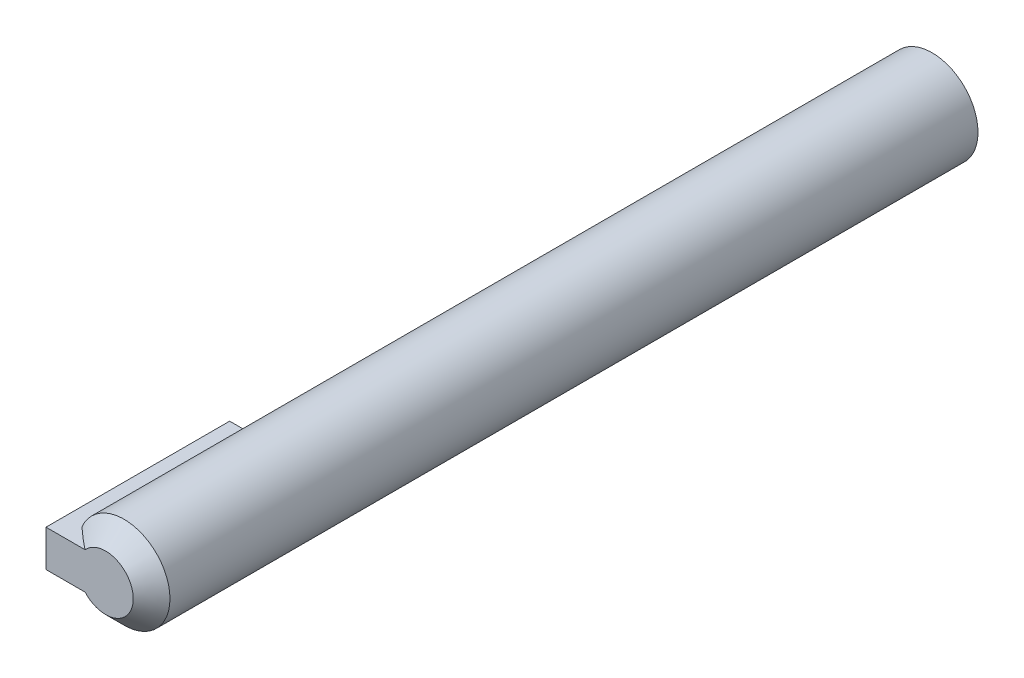
ISO-10303-21;
HEADER;
FILE_DESCRIPTION(('STEP AP214'),'2;1');
FILE_NAME('part.step','',(''),(''),'','','');
FILE_SCHEMA(('AUTOMOTIVE_DESIGN { 1 0 10303 214 1 1 1 1 }'));
ENDSEC;
DATA;
#1=APPLICATION_CONTEXT('core data for automotive mechanical design processes');
#2=APPLICATION_PROTOCOL_DEFINITION('international standard','automotive_design',2000,#1);
#3=PRODUCT_CONTEXT('',#1,'mechanical');
#4=PRODUCT('Part','Part','',(#3));
#5=PRODUCT_RELATED_PRODUCT_CATEGORY('part','',(#4));
#6=PRODUCT_DEFINITION_FORMATION('','',#4);
#7=PRODUCT_DEFINITION_CONTEXT('part definition',#1,'design');
#8=PRODUCT_DEFINITION('design','',#6,#7);
#9=PRODUCT_DEFINITION_SHAPE('','',#8);
#10=(LENGTH_UNIT() NAMED_UNIT(*) SI_UNIT(.MILLI.,.METRE.));
#11=(NAMED_UNIT(*) PLANE_ANGLE_UNIT() SI_UNIT($,.RADIAN.));
#12=(NAMED_UNIT(*) SI_UNIT($,.STERADIAN.) SOLID_ANGLE_UNIT());
#13=UNCERTAINTY_MEASURE_WITH_UNIT(LENGTH_MEASURE(1.E-05),#10,'distance_accuracy_value','');
#14=(GEOMETRIC_REPRESENTATION_CONTEXT(3) GLOBAL_UNCERTAINTY_ASSIGNED_CONTEXT((#13)) GLOBAL_UNIT_ASSIGNED_CONTEXT((#10,
#11,#12)) REPRESENTATION_CONTEXT('',''));
#15=CARTESIAN_POINT('',(0.,0.,0.));
#16=DIRECTION('',(0.,0.,1.));
#17=DIRECTION('',(1.,0.,0.));
#18=AXIS2_PLACEMENT_3D('',#15,#16,#17);
#19=CARTESIAN_POINT('',(0.,0.,90.));
#20=DIRECTION('',(0.,0.,-1.));
#21=DIRECTION('',(-1.,0.,0.));
#22=AXIS2_PLACEMENT_3D('',#19,#20,#21);
#23=CYLINDRICAL_SURFACE('',#22,5.);
#24=DIRECTION('',(0.,0.,-1.));
#25=VECTOR('',#24,1.);
#26=CARTESIAN_POINT('',(-4.58257569495584,2.,90.));
#27=LINE('',#26,#25);
#28=CARTESIAN_POINT('',(-4.58257569495584,2.,70.));
#29=VERTEX_POINT('',#28);
#30=CARTESIAN_POINT('',(-4.58257569495584,2.,88.));
#31=VERTEX_POINT('',#30);
#32=EDGE_CURVE('E123',#29,#31,#27,.F.);
#33=ORIENTED_EDGE('',*,*,#32,.T.);
#34=CARTESIAN_POINT('',(0.,0.,88.));
#35=DIRECTION('',(0.,0.,1.));
#36=DIRECTION('',(1.,0.,0.));
#37=AXIS2_PLACEMENT_3D('',#34,#35,#36);
#38=CIRCLE('',#37,5.);
#39=CARTESIAN_POINT('',(-4.58257569495584,-2.,88.));
#40=VERTEX_POINT('',#39);
#41=EDGE_CURVE('E57',#31,#40,#38,.F.);
#42=ORIENTED_EDGE('',*,*,#41,.T.);
#43=DIRECTION('',(0.,0.,-1.));
#44=VECTOR('',#43,1.);
#45=CARTESIAN_POINT('',(-4.58257569495584,-2.,90.));
#46=LINE('',#45,#44);
#47=CARTESIAN_POINT('',(-4.58257569495584,-2.,70.));
#48=VERTEX_POINT('',#47);
#49=EDGE_CURVE('E120',#40,#48,#46,.T.);
#50=ORIENTED_EDGE('',*,*,#49,.T.);
#51=CARTESIAN_POINT('',(0.,0.,70.));
#52=DIRECTION('',(0.,0.,1.));
#53=DIRECTION('',(1.,0.,0.));
#54=AXIS2_PLACEMENT_3D('',#51,#52,#53);
#55=CIRCLE('',#54,5.);
#56=EDGE_CURVE('E107',#29,#48,#55,.T.);
#57=ORIENTED_EDGE('',*,*,#56,.F.);
#58=EDGE_LOOP('',(#33,#42,#50,#57));
#59=FACE_BOUND('',#58,.T.);
#60=CARTESIAN_POINT('',(0.,0.,0.));
#61=DIRECTION('',(0.,0.,1.));
#62=DIRECTION('',(1.,0.,0.));
#63=AXIS2_PLACEMENT_3D('',#60,#61,#62);
#64=CIRCLE('',#63,5.);
#65=CARTESIAN_POINT('',(5.,0.,0.));
#66=VERTEX_POINT('',#65);
#67=EDGE_CURVE('E125',#66,#66,#64,.T.);
#68=ORIENTED_EDGE('',*,*,#67,.T.);
#69=EDGE_LOOP('',(#68));
#70=FACE_BOUND('',#69,.T.);
#71=ADVANCED_FACE('F36',(#59,#70),#23,.T.);
#72=CARTESIAN_POINT('',(0.,0.,90.));
#73=DIRECTION('',(0.,0.,1.));
#74=DIRECTION('',(1.,0.,0.));
#75=AXIS2_PLACEMENT_3D('',#72,#73,#74);
#76=PLANE('',#75);
#77=CARTESIAN_POINT('',(0.,0.,90.));
#78=DIRECTION('',(0.,0.,1.));
#79=DIRECTION('',(1.,0.,0.));
#80=AXIS2_PLACEMENT_3D('',#77,#78,#79);
#81=CIRCLE('',#80,3.00000000000004);
#82=CARTESIAN_POINT('',(-2.23606797749985,-2.,90.));
#83=VERTEX_POINT('',#82);
#84=CARTESIAN_POINT('',(-2.23606797749985,2.,90.));
#85=VERTEX_POINT('',#84);
#86=EDGE_CURVE('E129',#83,#85,#81,.T.);
#87=ORIENTED_EDGE('',*,*,#86,.T.);
#88=DIRECTION('',(-1.,0.,0.));
#89=VECTOR('',#88,1.);
#90=CARTESIAN_POINT('',(-6.5,2.,90.));
#91=LINE('',#90,#89);
#92=CARTESIAN_POINT('',(-6.5,2.,90.));
#93=VERTEX_POINT('',#92);
#94=EDGE_CURVE('E112',#85,#93,#91,.T.);
#95=ORIENTED_EDGE('',*,*,#94,.T.);
#96=DIRECTION('',(0.,-1.,0.));
#97=VECTOR('',#96,1.);
#98=CARTESIAN_POINT('',(-6.5,2.,90.));
#99=LINE('',#98,#97);
#100=CARTESIAN_POINT('',(-6.5,-2.,90.));
#101=VERTEX_POINT('',#100);
#102=EDGE_CURVE('E117',#93,#101,#99,.T.);
#103=ORIENTED_EDGE('',*,*,#102,.T.);
#104=DIRECTION('',(1.,0.,0.));
#105=VECTOR('',#104,1.);
#106=CARTESIAN_POINT('',(-6.5,-2.,90.));
#107=LINE('',#106,#105);
#108=EDGE_CURVE('E92',#101,#83,#107,.T.);
#109=ORIENTED_EDGE('',*,*,#108,.T.);
#110=EDGE_LOOP('',(#87,#95,#103,#109));
#111=FACE_BOUND('',#110,.T.);
#112=ADVANCED_FACE('F147',(#111),#76,.T.);
#113=CARTESIAN_POINT('',(0.,0.,0.));
#114=DIRECTION('',(0.,0.,1.));
#115=DIRECTION('',(1.,0.,0.));
#116=AXIS2_PLACEMENT_3D('',#113,#114,#115);
#117=PLANE('',#116);
#118=ORIENTED_EDGE('',*,*,#67,.F.);
#119=EDGE_LOOP('',(#118));
#120=FACE_BOUND('',#119,.T.);
#121=ADVANCED_FACE('F141',(#120),#117,.F.);
#122=CARTESIAN_POINT('',(-6.5,2.,70.));
#123=DIRECTION('',(0.,1.,0.));
#124=DIRECTION('',(-1.,0.,0.));
#125=AXIS2_PLACEMENT_3D('',#122,#123,#124);
#126=PLANE('',#125);
#127=ORIENTED_EDGE('',*,*,#32,.F.);
#128=DIRECTION('',(-1.,0.,0.));
#129=VECTOR('',#128,1.);
#130=CARTESIAN_POINT('',(-6.5,2.,70.));
#131=LINE('',#130,#129);
#132=CARTESIAN_POINT('',(-6.5,2.,70.));
#133=VERTEX_POINT('',#132);
#134=EDGE_CURVE('E98',#29,#133,#131,.T.);
#135=ORIENTED_EDGE('',*,*,#134,.T.);
#136=DIRECTION('',(0.,0.,1.));
#137=VECTOR('',#136,1.);
#138=CARTESIAN_POINT('',(-6.5,2.,70.));
#139=LINE('',#138,#137);
#140=EDGE_CURVE('E97',#133,#93,#139,.T.);
#141=ORIENTED_EDGE('',*,*,#140,.T.);
#142=ORIENTED_EDGE('',*,*,#94,.F.);
#143=CARTESIAN_POINT('',(-2.23606797749985,2.,90.));
#144=CARTESIAN_POINT('',(-2.33915384284018,2.,89.9231017381439));
#145=CARTESIAN_POINT('',(-2.44115372591159,2.,89.8447784799074));
#146=CARTESIAN_POINT('',(-2.64336214519346,2.,89.6858860323232));
#147=CARTESIAN_POINT('',(-2.74357100537283,2.,89.6053172560441));
#148=CARTESIAN_POINT('',(-2.94256089427975,2.,89.4425538654563));
#149=CARTESIAN_POINT('',(-3.04134267471727,2.,89.3603601654586));
#150=CARTESIAN_POINT('',(-3.23780663336876,2.,89.1946605846923));
#151=CARTESIAN_POINT('',(-3.33548875358575,2.,89.111154635266));
#152=CARTESIAN_POINT('',(-3.62712591119935,2.,88.859178486228));
#153=CARTESIAN_POINT('',(-3.81975836897592,2.,88.6891782636486));
#154=CARTESIAN_POINT('',(-4.10696355047801,2.,88.4321381138943));
#155=CARTESIAN_POINT('',(-4.20243427517563,2.,88.3460939364154));
#156=CARTESIAN_POINT('',(-4.39286529959692,2.,88.1734432700433));
#157=CARTESIAN_POINT('',(-4.48782560166226,2.,88.0868367837338));
#158=CARTESIAN_POINT('',(-4.58257569495584,2.,88.));
#159=B_SPLINE_CURVE_WITH_KNOTS('',3,(#143,#144,#145,#146,#147,#148,#149,#150,#151,#152,#153,
#154,#155,#156,#157,#158),.UNSPECIFIED.,.F.,.F.,(4,2,2,2,2,2,2,4),(0.,0.38578531088448,
0.771500118000438,1.15700374319313,1.54252760580051,2.31323802375784,2.69880726228812,
3.08437473043794),.UNSPECIFIED.);
#160=EDGE_CURVE('E50',#85,#31,#159,.T.);
#161=ORIENTED_EDGE('',*,*,#160,.T.);
#162=EDGE_LOOP('',(#127,#135,#141,#142,#161));
#163=FACE_BOUND('',#162,.T.);
#164=ADVANCED_FACE('F137',(#163),#126,.T.);
#165=CARTESIAN_POINT('',(-6.5,-2.,70.));
#166=DIRECTION('',(0.,-1.,0.));
#167=DIRECTION('',(0.,0.,-1.));
#168=AXIS2_PLACEMENT_3D('',#165,#166,#167);
#169=PLANE('',#168);
#170=ORIENTED_EDGE('',*,*,#49,.F.);
#171=CARTESIAN_POINT('',(-4.58257569495584,-2.,88.));
#172=CARTESIAN_POINT('',(-4.48782560166226,-2.,88.0868367837338));
#173=CARTESIAN_POINT('',(-4.39286529959691,-2.,88.1734432700433));
#174=CARTESIAN_POINT('',(-4.20243427517562,-2.,88.3460939364154));
#175=CARTESIAN_POINT('',(-4.10696355047801,-2.,88.4321381138943));
#176=CARTESIAN_POINT('',(-3.81975836897593,-2.,88.6891782636486));
#177=CARTESIAN_POINT('',(-3.62712591119935,-2.,88.859178486228));
#178=CARTESIAN_POINT('',(-3.33548875358575,-2.,89.111154635266));
#179=CARTESIAN_POINT('',(-3.23780663336876,-2.,89.1946605846923));
#180=CARTESIAN_POINT('',(-3.04134267471726,-2.,89.3603601654586));
#181=CARTESIAN_POINT('',(-2.94256089427975,-2.,89.4425538654563));
#182=CARTESIAN_POINT('',(-2.74357100537283,-2.,89.6053172560441));
#183=CARTESIAN_POINT('',(-2.64336214519345,-2.,89.6858860323232));
#184=CARTESIAN_POINT('',(-2.44115372591159,-2.,89.8447784799074));
#185=CARTESIAN_POINT('',(-2.33915384284018,-2.,89.9231017381439));
#186=CARTESIAN_POINT('',(-2.23606797749985,-2.,90.));
#187=B_SPLINE_CURVE_WITH_KNOTS('',3,(#171,#172,#173,#174,#175,#176,#177,#178,#179,#180,#181,
#182,#183,#184,#185,#186),.UNSPECIFIED.,.F.,.F.,(4,2,2,2,2,2,2,4),(0.,0.385567468149824,
0.771136706680099,1.54184712463743,1.9273709872448,2.3128746124375,2.69858941955346,
3.08437473043793),.UNSPECIFIED.);
#188=EDGE_CURVE('E11',#40,#83,#187,.T.);
#189=ORIENTED_EDGE('',*,*,#188,.T.);
#190=ORIENTED_EDGE('',*,*,#108,.F.);
#191=DIRECTION('',(0.,0.,1.));
#192=VECTOR('',#191,1.);
#193=CARTESIAN_POINT('',(-6.5,-2.,70.));
#194=LINE('',#193,#192);
#195=CARTESIAN_POINT('',(-6.5,-2.,70.));
#196=VERTEX_POINT('',#195);
#197=EDGE_CURVE('E88',#196,#101,#194,.T.);
#198=ORIENTED_EDGE('',*,*,#197,.F.);
#199=DIRECTION('',(1.,0.,0.));
#200=VECTOR('',#199,1.);
#201=CARTESIAN_POINT('',(-6.5,-2.,70.));
#202=LINE('',#201,#200);
#203=EDGE_CURVE('E91',#196,#48,#202,.T.);
#204=ORIENTED_EDGE('',*,*,#203,.T.);
#205=EDGE_LOOP('',(#170,#189,#190,#198,#204));
#206=FACE_BOUND('',#205,.T.);
#207=ADVANCED_FACE('F90',(#206),#169,.T.);
#208=CARTESIAN_POINT('',(-6.5,2.,70.));
#209=DIRECTION('',(-1.,0.,0.));
#210=DIRECTION('',(0.,-1.,0.));
#211=AXIS2_PLACEMENT_3D('',#208,#209,#210);
#212=PLANE('',#211);
#213=ORIENTED_EDGE('',*,*,#102,.F.);
#214=ORIENTED_EDGE('',*,*,#140,.F.);
#215=DIRECTION('',(0.,-1.,0.));
#216=VECTOR('',#215,1.);
#217=CARTESIAN_POINT('',(-6.5,2.,70.));
#218=LINE('',#217,#216);
#219=EDGE_CURVE('E105',#133,#196,#218,.T.);
#220=ORIENTED_EDGE('',*,*,#219,.T.);
#221=ORIENTED_EDGE('',*,*,#197,.T.);
#222=EDGE_LOOP('',(#213,#214,#220,#221));
#223=FACE_BOUND('',#222,.T.);
#224=ADVANCED_FACE('F110',(#223),#212,.T.);
#225=CARTESIAN_POINT('',(0.,0.,70.));
#226=DIRECTION('',(0.,0.,1.));
#227=DIRECTION('',(1.,0.,0.));
#228=AXIS2_PLACEMENT_3D('',#225,#226,#227);
#229=PLANE('',#228);
#230=ORIENTED_EDGE('',*,*,#134,.F.);
#231=ORIENTED_EDGE('',*,*,#56,.T.);
#232=ORIENTED_EDGE('',*,*,#203,.F.);
#233=ORIENTED_EDGE('',*,*,#219,.F.);
#234=EDGE_LOOP('',(#230,#231,#232,#233));
#235=FACE_BOUND('',#234,.T.);
#236=ADVANCED_FACE('F104',(#235),#229,.F.);
#237=CARTESIAN_POINT('',(0.,0.,90.));
#238=DIRECTION('',(0.,0.,-1.));
#239=DIRECTION('',(-1.,0.,0.));
#240=AXIS2_PLACEMENT_3D('',#237,#238,#239);
#241=CONICAL_SURFACE('',#240,3.00000000000004,0.785398163397448);
#242=ORIENTED_EDGE('',*,*,#188,.F.);
#243=ORIENTED_EDGE('',*,*,#41,.F.);
#244=ORIENTED_EDGE('',*,*,#160,.F.);
#245=ORIENTED_EDGE('',*,*,#86,.F.);
#246=EDGE_LOOP('',(#242,#243,#244,#245));
#247=FACE_BOUND('',#246,.T.);
#248=ADVANCED_FACE('F38',(#247),#241,.T.);
#249=CLOSED_SHELL('',(#71,#112,#121,#164,#207,#224,#236,#248));
#250=MANIFOLD_SOLID_BREP('B2',#249);
#251=ADVANCED_BREP_SHAPE_REPRESENTATION('',(#18,#250),#14);
#252=SHAPE_DEFINITION_REPRESENTATION(#9,#251);
ENDSEC;
END-ISO-10303-21;
